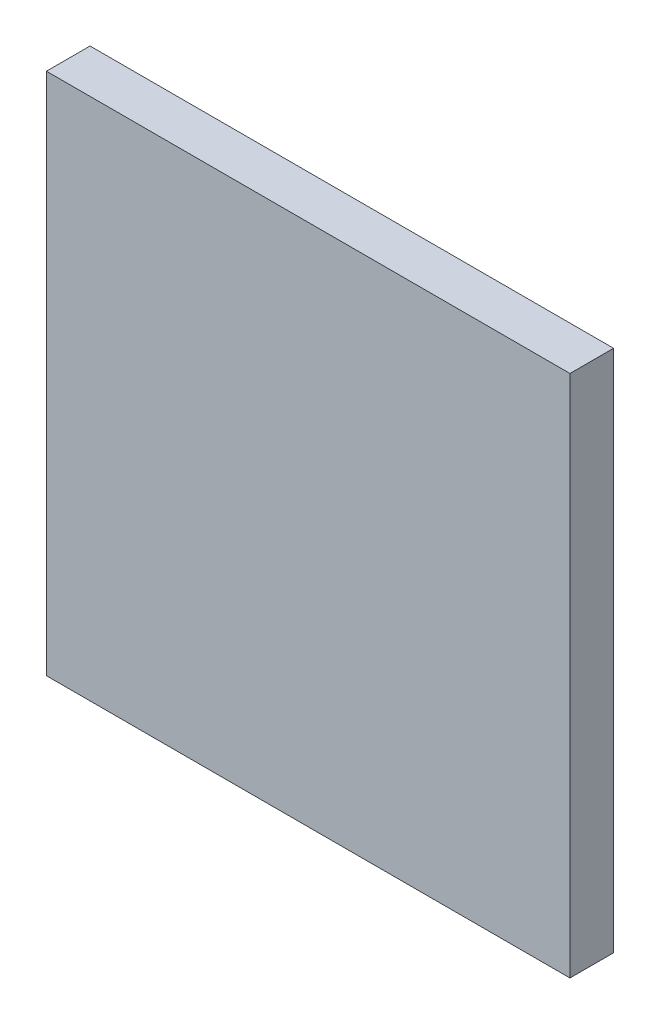
ISO-10303-21;
HEADER;
FILE_DESCRIPTION(('STEP AP214'),'2;1');
FILE_NAME('part.step','',(''),(''),'','','');
FILE_SCHEMA(('AUTOMOTIVE_DESIGN { 1 0 10303 214 1 1 1 1 }'));
ENDSEC;
DATA;
#1=APPLICATION_CONTEXT('core data for automotive mechanical design processes');
#2=APPLICATION_PROTOCOL_DEFINITION('international standard','automotive_design',2000,#1);
#3=PRODUCT_CONTEXT('',#1,'mechanical');
#4=PRODUCT('Part','Part','',(#3));
#5=PRODUCT_RELATED_PRODUCT_CATEGORY('part','',(#4));
#6=PRODUCT_DEFINITION_FORMATION('','',#4);
#7=PRODUCT_DEFINITION_CONTEXT('part definition',#1,'design');
#8=PRODUCT_DEFINITION('design','',#6,#7);
#9=PRODUCT_DEFINITION_SHAPE('','',#8);
#10=(LENGTH_UNIT() NAMED_UNIT(*) SI_UNIT(.MILLI.,.METRE.));
#11=(NAMED_UNIT(*) PLANE_ANGLE_UNIT() SI_UNIT($,.RADIAN.));
#12=(NAMED_UNIT(*) SI_UNIT($,.STERADIAN.) SOLID_ANGLE_UNIT());
#13=UNCERTAINTY_MEASURE_WITH_UNIT(LENGTH_MEASURE(1.E-05),#10,'distance_accuracy_value','');
#14=(GEOMETRIC_REPRESENTATION_CONTEXT(3) GLOBAL_UNCERTAINTY_ASSIGNED_CONTEXT((#13)) GLOBAL_UNIT_ASSIGNED_CONTEXT((#10,
#11,#12)) REPRESENTATION_CONTEXT('',''));
#15=CARTESIAN_POINT('',(0.,0.,0.));
#16=DIRECTION('',(0.,0.,1.));
#17=DIRECTION('',(1.,0.,0.));
#18=AXIS2_PLACEMENT_3D('',#15,#16,#17);
#19=CARTESIAN_POINT('',(-55.2830188679245,34.5283018867925,5.));
#20=DIRECTION('',(1.,0.,0.));
#21=DIRECTION('',(0.,1.,0.));
#22=AXIS2_PLACEMENT_3D('',#19,#20,#21);
#23=PLANE('',#22);
#24=DIRECTION('',(0.,-1.,0.));
#25=VECTOR('',#24,1.);
#26=CARTESIAN_POINT('',(-55.2830188679245,34.5283018867925,0.));
#27=LINE('',#26,#25);
#28=CARTESIAN_POINT('',(-55.2830188679245,34.5283018867925,0.));
#29=VERTEX_POINT('',#28);
#30=CARTESIAN_POINT('',(-55.2830188679245,-25.4716981132075,0.));
#31=VERTEX_POINT('',#30);
#32=EDGE_CURVE('E98',#29,#31,#27,.T.);
#33=ORIENTED_EDGE('',*,*,#32,.T.);
#34=DIRECTION('',(0.,0.,-1.));
#35=VECTOR('',#34,1.);
#36=CARTESIAN_POINT('',(-55.2830188679245,-25.4716981132075,5.));
#37=LINE('',#36,#35);
#38=CARTESIAN_POINT('',(-55.2830188679245,-25.4716981132075,5.));
#39=VERTEX_POINT('',#38);
#40=EDGE_CURVE('E11',#39,#31,#37,.T.);
#41=ORIENTED_EDGE('',*,*,#40,.F.);
#42=DIRECTION('',(0.,-1.,0.));
#43=VECTOR('',#42,1.);
#44=CARTESIAN_POINT('',(-55.2830188679245,34.5283018867925,5.));
#45=LINE('',#44,#43);
#46=CARTESIAN_POINT('',(-55.2830188679245,34.5283018867925,5.));
#47=VERTEX_POINT('',#46);
#48=EDGE_CURVE('E86',#47,#39,#45,.T.);
#49=ORIENTED_EDGE('',*,*,#48,.F.);
#50=DIRECTION('',(0.,0.,-1.));
#51=VECTOR('',#50,1.);
#52=CARTESIAN_POINT('',(-55.2830188679245,34.5283018867925,5.));
#53=LINE('',#52,#51);
#54=EDGE_CURVE('E94',#47,#29,#53,.T.);
#55=ORIENTED_EDGE('',*,*,#54,.T.);
#56=EDGE_LOOP('',(#33,#41,#49,#55));
#57=FACE_BOUND('',#56,.T.);
#58=ADVANCED_FACE('F35',(#57),#23,.F.);
#59=CARTESIAN_POINT('',(-55.2830188679245,-25.4716981132075,5.));
#60=DIRECTION('',(0.,1.,0.));
#61=DIRECTION('',(0.,0.,1.));
#62=AXIS2_PLACEMENT_3D('',#59,#60,#61);
#63=PLANE('',#62);
#64=DIRECTION('',(1.,0.,0.));
#65=VECTOR('',#64,1.);
#66=CARTESIAN_POINT('',(-55.2830188679245,-25.4716981132075,0.));
#67=LINE('',#66,#65);
#68=CARTESIAN_POINT('',(4.71698113207548,-25.4716981132075,0.));
#69=VERTEX_POINT('',#68);
#70=EDGE_CURVE('E90',#31,#69,#67,.T.);
#71=ORIENTED_EDGE('',*,*,#70,.T.);
#72=DIRECTION('',(0.,0.,-1.));
#73=VECTOR('',#72,1.);
#74=CARTESIAN_POINT('',(4.71698113207548,-25.4716981132075,5.));
#75=LINE('',#74,#73);
#76=CARTESIAN_POINT('',(4.71698113207548,-25.4716981132075,5.));
#77=VERTEX_POINT('',#76);
#78=EDGE_CURVE('E43',#77,#69,#75,.T.);
#79=ORIENTED_EDGE('',*,*,#78,.F.);
#80=DIRECTION('',(1.,0.,0.));
#81=VECTOR('',#80,1.);
#82=CARTESIAN_POINT('',(-55.2830188679245,-25.4716981132075,5.));
#83=LINE('',#82,#81);
#84=EDGE_CURVE('E81',#39,#77,#83,.T.);
#85=ORIENTED_EDGE('',*,*,#84,.F.);
#86=ORIENTED_EDGE('',*,*,#40,.T.);
#87=EDGE_LOOP('',(#71,#79,#85,#86));
#88=FACE_BOUND('',#87,.T.);
#89=ADVANCED_FACE('F89',(#88),#63,.F.);
#90=CARTESIAN_POINT('',(4.71698113207547,34.5283018867925,5.));
#91=DIRECTION('',(-1.,0.,0.));
#92=DIRECTION('',(0.,-1.,0.));
#93=AXIS2_PLACEMENT_3D('',#90,#91,#92);
#94=PLANE('',#93);
#95=DIRECTION('',(0.,1.,0.));
#96=VECTOR('',#95,1.);
#97=CARTESIAN_POINT('',(4.71698113207547,34.5283018867925,0.));
#98=LINE('',#97,#96);
#99=CARTESIAN_POINT('',(4.71698113207547,34.5283018867925,0.));
#100=VERTEX_POINT('',#99);
#101=EDGE_CURVE('E68',#69,#100,#98,.T.);
#102=ORIENTED_EDGE('',*,*,#101,.T.);
#103=DIRECTION('',(0.,0.,-1.));
#104=VECTOR('',#103,1.);
#105=CARTESIAN_POINT('',(4.71698113207547,34.5283018867925,5.));
#106=LINE('',#105,#104);
#107=CARTESIAN_POINT('',(4.71698113207547,34.5283018867925,5.));
#108=VERTEX_POINT('',#107);
#109=EDGE_CURVE('E91',#108,#100,#106,.T.);
#110=ORIENTED_EDGE('',*,*,#109,.F.);
#111=DIRECTION('',(0.,1.,0.));
#112=VECTOR('',#111,1.);
#113=CARTESIAN_POINT('',(4.71698113207547,34.5283018867925,5.));
#114=LINE('',#113,#112);
#115=EDGE_CURVE('E84',#77,#108,#114,.T.);
#116=ORIENTED_EDGE('',*,*,#115,.F.);
#117=ORIENTED_EDGE('',*,*,#78,.T.);
#118=EDGE_LOOP('',(#102,#110,#116,#117));
#119=FACE_BOUND('',#118,.T.);
#120=ADVANCED_FACE('F92',(#119),#94,.F.);
#121=CARTESIAN_POINT('',(-55.2830188679245,34.5283018867925,5.));
#122=DIRECTION('',(0.,-1.,0.));
#123=DIRECTION('',(0.,0.,-1.));
#124=AXIS2_PLACEMENT_3D('',#121,#122,#123);
#125=PLANE('',#124);
#126=DIRECTION('',(-1.,0.,0.));
#127=VECTOR('',#126,1.);
#128=CARTESIAN_POINT('',(-55.2830188679245,34.5283018867925,0.));
#129=LINE('',#128,#127);
#130=EDGE_CURVE('E74',#100,#29,#129,.T.);
#131=ORIENTED_EDGE('',*,*,#130,.T.);
#132=ORIENTED_EDGE('',*,*,#54,.F.);
#133=DIRECTION('',(-1.,0.,0.));
#134=VECTOR('',#133,1.);
#135=CARTESIAN_POINT('',(-55.2830188679245,34.5283018867925,5.));
#136=LINE('',#135,#134);
#137=EDGE_CURVE('E51',#108,#47,#136,.T.);
#138=ORIENTED_EDGE('',*,*,#137,.F.);
#139=ORIENTED_EDGE('',*,*,#109,.T.);
#140=EDGE_LOOP('',(#131,#132,#138,#139));
#141=FACE_BOUND('',#140,.T.);
#142=ADVANCED_FACE('F105',(#141),#125,.F.);
#143=CARTESIAN_POINT('',(0.,0.,5.));
#144=DIRECTION('',(0.,0.,1.));
#145=DIRECTION('',(1.,0.,0.));
#146=AXIS2_PLACEMENT_3D('',#143,#144,#145);
#147=PLANE('',#146);
#148=ORIENTED_EDGE('',*,*,#48,.T.);
#149=ORIENTED_EDGE('',*,*,#84,.T.);
#150=ORIENTED_EDGE('',*,*,#115,.T.);
#151=ORIENTED_EDGE('',*,*,#137,.T.);
#152=EDGE_LOOP('',(#148,#149,#150,#151));
#153=FACE_BOUND('',#152,.T.);
#154=ADVANCED_FACE('F82',(#153),#147,.T.);
#155=CARTESIAN_POINT('',(0.,0.,0.));
#156=DIRECTION('',(0.,0.,1.));
#157=DIRECTION('',(1.,0.,0.));
#158=AXIS2_PLACEMENT_3D('',#155,#156,#157);
#159=PLANE('',#158);
#160=ORIENTED_EDGE('',*,*,#32,.F.);
#161=ORIENTED_EDGE('',*,*,#130,.F.);
#162=ORIENTED_EDGE('',*,*,#101,.F.);
#163=ORIENTED_EDGE('',*,*,#70,.F.);
#164=EDGE_LOOP('',(#160,#161,#162,#163));
#165=FACE_BOUND('',#164,.T.);
#166=ADVANCED_FACE('F108',(#165),#159,.F.);
#167=CLOSED_SHELL('',(#58,#89,#120,#142,#154,#166));
#168=MANIFOLD_SOLID_BREP('B2',#167);
#169=ADVANCED_BREP_SHAPE_REPRESENTATION('',(#18,#168),#14);
#170=SHAPE_DEFINITION_REPRESENTATION(#9,#169);
ENDSEC;
END-ISO-10303-21;
